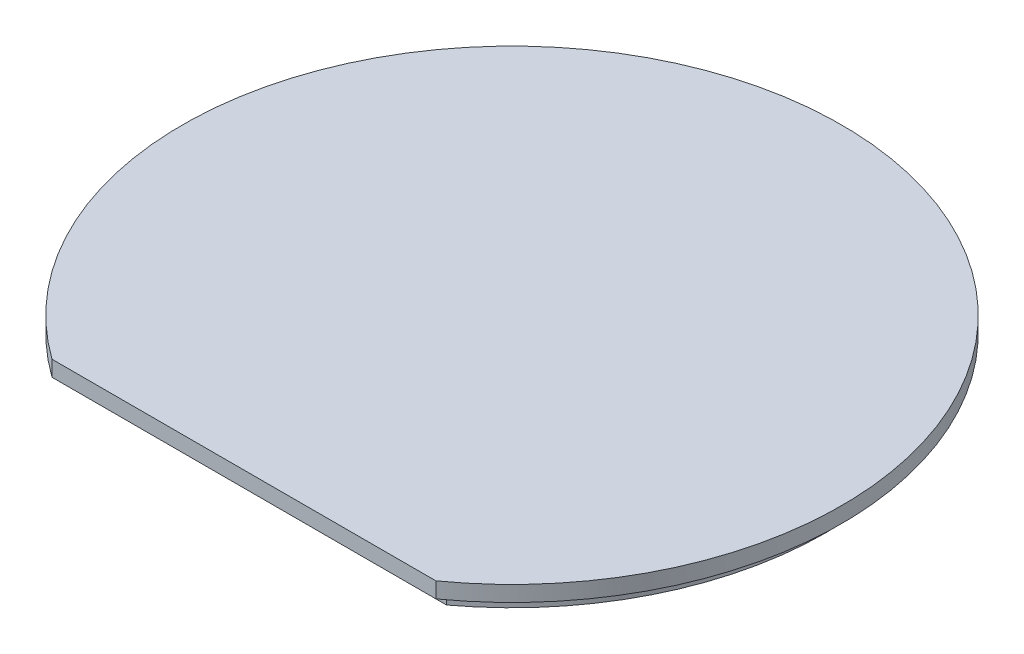
ISO-10303-21;
HEADER;
FILE_DESCRIPTION(('STEP AP214'),'2;1');
FILE_NAME('part.step','',(''),(''),'','','');
FILE_SCHEMA(('AUTOMOTIVE_DESIGN { 1 0 10303 214 1 1 1 1 }'));
ENDSEC;
DATA;
#1=APPLICATION_CONTEXT('core data for automotive mechanical design processes');
#2=APPLICATION_PROTOCOL_DEFINITION('international standard','automotive_design',2000,#1);
#3=PRODUCT_CONTEXT('',#1,'mechanical');
#4=PRODUCT('Part','Part','',(#3));
#5=PRODUCT_RELATED_PRODUCT_CATEGORY('part','',(#4));
#6=PRODUCT_DEFINITION_FORMATION('','',#4);
#7=PRODUCT_DEFINITION_CONTEXT('part definition',#1,'design');
#8=PRODUCT_DEFINITION('design','',#6,#7);
#9=PRODUCT_DEFINITION_SHAPE('','',#8);
#10=(LENGTH_UNIT() NAMED_UNIT(*) SI_UNIT(.MILLI.,.METRE.));
#11=(NAMED_UNIT(*) PLANE_ANGLE_UNIT() SI_UNIT($,.RADIAN.));
#12=(NAMED_UNIT(*) SI_UNIT($,.STERADIAN.) SOLID_ANGLE_UNIT());
#13=UNCERTAINTY_MEASURE_WITH_UNIT(LENGTH_MEASURE(1.E-05),#10,'distance_accuracy_value','');
#14=(GEOMETRIC_REPRESENTATION_CONTEXT(3) GLOBAL_UNCERTAINTY_ASSIGNED_CONTEXT((#13)) GLOBAL_UNIT_ASSIGNED_CONTEXT((#10,
#11,#12)) REPRESENTATION_CONTEXT('',''));
#15=CARTESIAN_POINT('',(0.,0.,0.));
#16=DIRECTION('',(0.,0.,1.));
#17=DIRECTION('',(1.,0.,0.));
#18=AXIS2_PLACEMENT_3D('',#15,#16,#17);
#19=CARTESIAN_POINT('',(0.,2.38125,0.));
#20=DIRECTION('',(0.,-1.,0.));
#21=DIRECTION('',(0.,0.,-1.));
#22=AXIS2_PLACEMENT_3D('',#19,#20,#21);
#23=CYLINDRICAL_SURFACE('',#22,50.165);
#24=CARTESIAN_POINT('',(0.,0.,0.));
#25=DIRECTION('',(0.,-1.,0.));
#26=DIRECTION('',(0.,0.,-1.));
#27=AXIS2_PLACEMENT_3D('',#24,#25,#26);
#28=CIRCLE('',#27,50.165);
#29=CARTESIAN_POINT('',(-29.2030912,0.,40.7885607660344));
#30=VERTEX_POINT('',#29);
#31=CARTESIAN_POINT('',(29.2030912,0.,40.7885607660344));
#32=VERTEX_POINT('',#31);
#33=EDGE_CURVE('E49',#30,#32,#28,.T.);
#34=ORIENTED_EDGE('',*,*,#33,.F.);
#35=DIRECTION('',(0.,-1.,0.));
#36=VECTOR('',#35,1.);
#37=CARTESIAN_POINT('',(-29.2030912,2.38125,40.7885607660344));
#38=LINE('',#37,#36);
#39=CARTESIAN_POINT('',(-29.2030912,2.38125,40.7885607660344));
#40=VERTEX_POINT('',#39);
#41=EDGE_CURVE('E44',#40,#30,#38,.T.);
#42=ORIENTED_EDGE('',*,*,#41,.F.);
#43=CARTESIAN_POINT('',(0.,2.38125,0.));
#44=DIRECTION('',(0.,1.,0.));
#45=DIRECTION('',(0.,0.,1.));
#46=AXIS2_PLACEMENT_3D('',#43,#44,#45);
#47=CIRCLE('',#46,50.165);
#48=CARTESIAN_POINT('',(29.2030912,2.38125,40.7885607660344));
#49=VERTEX_POINT('',#48);
#50=EDGE_CURVE('E97',#49,#40,#47,.T.);
#51=ORIENTED_EDGE('',*,*,#50,.F.);
#52=DIRECTION('',(0.,-1.,0.));
#53=VECTOR('',#52,1.);
#54=CARTESIAN_POINT('',(29.2030912,2.38125,40.7885607660344));
#55=LINE('',#54,#53);
#56=EDGE_CURVE('E102',#49,#32,#55,.T.);
#57=ORIENTED_EDGE('',*,*,#56,.T.);
#58=EDGE_LOOP('',(#34,#42,#51,#57));
#59=FACE_BOUND('',#58,.T.);
#60=ADVANCED_FACE('F37',(#59),#23,.T.);
#61=CARTESIAN_POINT('',(-29.2030912,2.38125,40.7885607660344));
#62=DIRECTION('',(0.,0.,-1.));
#63=DIRECTION('',(-1.,0.,0.));
#64=AXIS2_PLACEMENT_3D('',#61,#62,#63);
#65=PLANE('',#64);
#66=DIRECTION('',(-1.,0.,0.));
#67=VECTOR('',#66,1.);
#68=CARTESIAN_POINT('',(-29.2030912,0.,40.7885607660344));
#69=LINE('',#68,#67);
#70=EDGE_CURVE('E12',#32,#30,#69,.T.);
#71=ORIENTED_EDGE('',*,*,#70,.F.);
#72=ORIENTED_EDGE('',*,*,#56,.F.);
#73=DIRECTION('',(1.,0.,0.));
#74=VECTOR('',#73,1.);
#75=CARTESIAN_POINT('',(-29.2030912,2.38125,40.7885607660344));
#76=LINE('',#75,#74);
#77=EDGE_CURVE('E100',#40,#49,#76,.T.);
#78=ORIENTED_EDGE('',*,*,#77,.F.);
#79=ORIENTED_EDGE('',*,*,#41,.T.);
#80=EDGE_LOOP('',(#71,#72,#78,#79));
#81=FACE_BOUND('',#80,.T.);
#82=ADVANCED_FACE('F107',(#81),#65,.F.);
#83=CARTESIAN_POINT('',(0.,2.38125,0.));
#84=DIRECTION('',(0.,1.,0.));
#85=DIRECTION('',(0.,0.,1.));
#86=AXIS2_PLACEMENT_3D('',#83,#84,#85);
#87=PLANE('',#86);
#88=ORIENTED_EDGE('',*,*,#50,.T.);
#89=ORIENTED_EDGE('',*,*,#77,.T.);
#90=EDGE_LOOP('',(#88,#89));
#91=FACE_BOUND('',#90,.T.);
#92=ADVANCED_FACE('F112',(#91),#87,.T.);
#93=CARTESIAN_POINT('',(0.,0.,-4.68821961698279));
#94=DIRECTION('',(0.,-1.,0.));
#95=DIRECTION('',(0.,0.,-1.));
#96=AXIS2_PLACEMENT_3D('',#93,#94,#95);
#97=PLANE('',#96);
#98=DIRECTION('',(-1.,0.,0.));
#99=VECTOR('',#98,1.);
#100=CARTESIAN_POINT('',(-28.4282472865239,0.,38.4073107660344));
#101=LINE('',#100,#99);
#102=CARTESIAN_POINT('',(28.4282472865239,0.,38.4073107660344));
#103=VERTEX_POINT('',#102);
#104=CARTESIAN_POINT('',(-28.4282472865239,0.,38.4073107660344));
#105=VERTEX_POINT('',#104);
#106=EDGE_CURVE('E80',#103,#105,#101,.T.);
#107=ORIENTED_EDGE('',*,*,#106,.F.);
#108=CARTESIAN_POINT('',(0.,0.,0.));
#109=DIRECTION('',(0.,-1.,0.));
#110=DIRECTION('',(0.,0.,-1.));
#111=AXIS2_PLACEMENT_3D('',#108,#109,#110);
#112=CIRCLE('',#111,47.78375);
#113=EDGE_CURVE('E88',#105,#103,#112,.T.);
#114=ORIENTED_EDGE('',*,*,#113,.F.);
#115=EDGE_LOOP('',(#107,#114));
#116=FACE_BOUND('',#115,.T.);
#117=ORIENTED_EDGE('',*,*,#33,.T.);
#118=ORIENTED_EDGE('',*,*,#70,.T.);
#119=EDGE_LOOP('',(#117,#118));
#120=FACE_BOUND('',#119,.T.);
#121=ADVANCED_FACE('F87',(#116,#120),#97,.T.);
#122=CARTESIAN_POINT('',(0.,0.,0.));
#123=DIRECTION('',(0.,-1.,0.));
#124=DIRECTION('',(0.,0.,-1.));
#125=AXIS2_PLACEMENT_3D('',#122,#123,#124);
#126=CYLINDRICAL_SURFACE('',#125,47.78375);
#127=CARTESIAN_POINT('',(0.,-2.38125,0.));
#128=DIRECTION('',(0.,-1.,0.));
#129=DIRECTION('',(0.,0.,-1.));
#130=AXIS2_PLACEMENT_3D('',#127,#128,#129);
#131=CIRCLE('',#130,47.78375);
#132=CARTESIAN_POINT('',(-28.4282472865239,-2.38125,38.4073107660344));
#133=VERTEX_POINT('',#132);
#134=CARTESIAN_POINT('',(28.4282472865239,-2.38125,38.4073107660344));
#135=VERTEX_POINT('',#134);
#136=EDGE_CURVE('E57',#133,#135,#131,.T.);
#137=ORIENTED_EDGE('',*,*,#136,.F.);
#138=DIRECTION('',(0.,-1.,0.));
#139=VECTOR('',#138,1.);
#140=CARTESIAN_POINT('',(-28.4282472865239,0.,38.4073107660344));
#141=LINE('',#140,#139);
#142=EDGE_CURVE('E84',#105,#133,#141,.T.);
#143=ORIENTED_EDGE('',*,*,#142,.F.);
#144=ORIENTED_EDGE('',*,*,#113,.T.);
#145=DIRECTION('',(0.,-1.,0.));
#146=VECTOR('',#145,1.);
#147=CARTESIAN_POINT('',(28.4282472865239,0.,38.4073107660344));
#148=LINE('',#147,#146);
#149=EDGE_CURVE('E77',#103,#135,#148,.T.);
#150=ORIENTED_EDGE('',*,*,#149,.T.);
#151=EDGE_LOOP('',(#137,#143,#144,#150));
#152=FACE_BOUND('',#151,.T.);
#153=ADVANCED_FACE('F90',(#152),#126,.T.);
#154=CARTESIAN_POINT('',(-28.4282472865239,0.,38.4073107660344));
#155=DIRECTION('',(0.,0.,1.));
#156=DIRECTION('',(1.,0.,0.));
#157=AXIS2_PLACEMENT_3D('',#154,#155,#156);
#158=PLANE('',#157);
#159=DIRECTION('',(-1.,0.,0.));
#160=VECTOR('',#159,1.);
#161=CARTESIAN_POINT('',(-28.4282472865239,-2.38125,38.4073107660344));
#162=LINE('',#161,#160);
#163=EDGE_CURVE('E82',#135,#133,#162,.T.);
#164=ORIENTED_EDGE('',*,*,#163,.F.);
#165=ORIENTED_EDGE('',*,*,#149,.F.);
#166=ORIENTED_EDGE('',*,*,#106,.T.);
#167=ORIENTED_EDGE('',*,*,#142,.T.);
#168=EDGE_LOOP('',(#164,#165,#166,#167));
#169=FACE_BOUND('',#168,.T.);
#170=ADVANCED_FACE('F79',(#169),#158,.T.);
#171=CARTESIAN_POINT('',(0.,-2.38125,0.));
#172=DIRECTION('',(0.,1.,0.));
#173=DIRECTION('',(0.,0.,1.));
#174=AXIS2_PLACEMENT_3D('',#171,#172,#173);
#175=PLANE('',#174);
#176=ORIENTED_EDGE('',*,*,#136,.T.);
#177=ORIENTED_EDGE('',*,*,#163,.T.);
#178=EDGE_LOOP('',(#176,#177));
#179=FACE_BOUND('',#178,.T.);
#180=ADVANCED_FACE('F152',(#179),#175,.F.);
#181=CLOSED_SHELL('',(#60,#82,#92,#121,#153,#170,#180));
#182=MANIFOLD_SOLID_BREP('B2',#181);
#183=ADVANCED_BREP_SHAPE_REPRESENTATION('',(#18,#182),#14);
#184=SHAPE_DEFINITION_REPRESENTATION(#9,#183);
ENDSEC;
END-ISO-10303-21;
